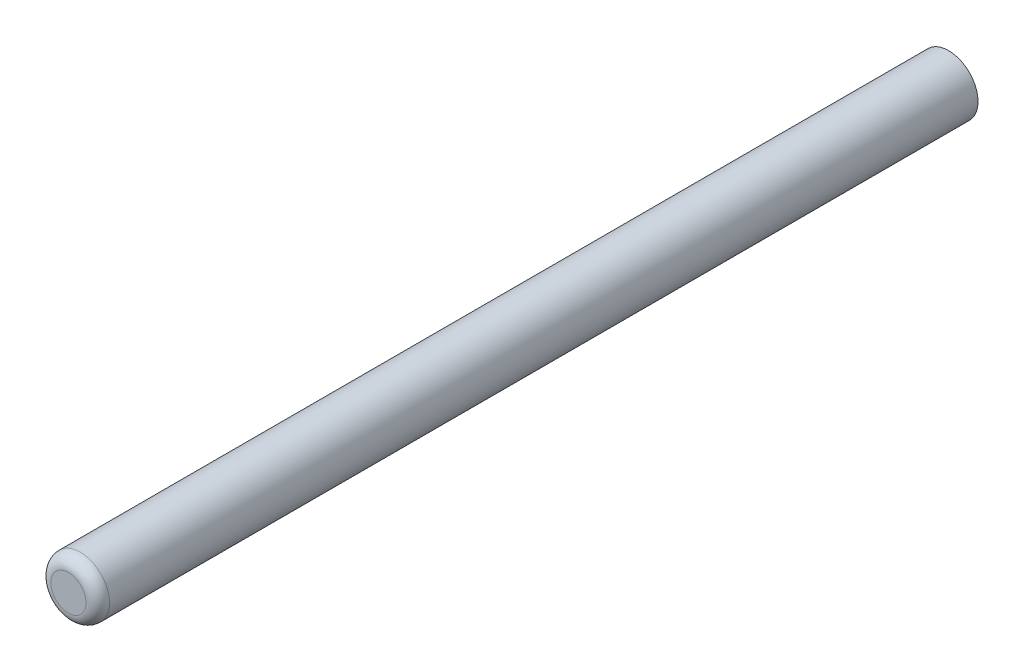
ISO-10303-21;
HEADER;
FILE_DESCRIPTION(('STEP AP214'),'2;1');
FILE_NAME('part.step','',(''),(''),'','','');
FILE_SCHEMA(('AUTOMOTIVE_DESIGN { 1 0 10303 214 1 1 1 1 }'));
ENDSEC;
DATA;
#1=APPLICATION_CONTEXT('core data for automotive mechanical design processes');
#2=APPLICATION_PROTOCOL_DEFINITION('international standard','automotive_design',2000,#1);
#3=PRODUCT_CONTEXT('',#1,'mechanical');
#4=PRODUCT('Part','Part','',(#3));
#5=PRODUCT_RELATED_PRODUCT_CATEGORY('part','',(#4));
#6=PRODUCT_DEFINITION_FORMATION('','',#4);
#7=PRODUCT_DEFINITION_CONTEXT('part definition',#1,'design');
#8=PRODUCT_DEFINITION('design','',#6,#7);
#9=PRODUCT_DEFINITION_SHAPE('','',#8);
#10=(LENGTH_UNIT() NAMED_UNIT(*) SI_UNIT(.MILLI.,.METRE.));
#11=(NAMED_UNIT(*) PLANE_ANGLE_UNIT() SI_UNIT($,.RADIAN.));
#12=(NAMED_UNIT(*) SI_UNIT($,.STERADIAN.) SOLID_ANGLE_UNIT());
#13=UNCERTAINTY_MEASURE_WITH_UNIT(LENGTH_MEASURE(1.E-05),#10,'distance_accuracy_value','');
#14=(GEOMETRIC_REPRESENTATION_CONTEXT(3) GLOBAL_UNCERTAINTY_ASSIGNED_CONTEXT((#13)) GLOBAL_UNIT_ASSIGNED_CONTEXT((#10,
#11,#12)) REPRESENTATION_CONTEXT('',''));
#15=CARTESIAN_POINT('',(0.,0.,0.));
#16=DIRECTION('',(0.,0.,1.));
#17=DIRECTION('',(1.,0.,0.));
#18=AXIS2_PLACEMENT_3D('',#15,#16,#17);
#19=CARTESIAN_POINT('',(3.82033078646985E-09,-9.72969439461123E-07,36.9));
#20=DIRECTION('',(0.,0.,1.));
#21=DIRECTION('',(0.,-1.,0.));
#22=AXIS2_PLACEMENT_3D('',#19,#20,#21);
#23=PLANE('',#22);
#24=CARTESIAN_POINT('',(3.82033071844035E-09,-9.72969439461123E-07,36.9));
#25=DIRECTION('',(0.,0.,-1.));
#26=DIRECTION('',(1.,0.,0.));
#27=AXIS2_PLACEMENT_3D('',#24,#25,#26);
#28=CIRCLE('',#27,0.6);
#29=CARTESIAN_POINT('',(0.600000003820331,-9.72969439387644E-07,36.9));
#30=VERTEX_POINT('',#29);
#31=EDGE_CURVE('E22',#30,#30,#28,.T.);
#32=ORIENTED_EDGE('',*,*,#31,.F.);
#33=EDGE_LOOP('',(#32));
#34=FACE_BOUND('',#33,.T.);
#35=ADVANCED_FACE('F14',(#34),#23,.T.);
#36=CARTESIAN_POINT('',(3.82033071844035E-09,-9.72969439461124E-07,24.9));
#37=DIRECTION('',(0.,0.,1.));
#38=DIRECTION('',(1.,0.,0.));
#39=AXIS2_PLACEMENT_3D('',#36,#37,#38);
#40=CYLINDRICAL_SURFACE('',#39,1.);
#41=CARTESIAN_POINT('',(3.82033960022454E-09,-9.72969544932312E-07,6.9));
#42=DIRECTION('',(0.,0.,-1.));
#43=DIRECTION('',(1.,0.,0.));
#44=AXIS2_PLACEMENT_3D('',#41,#42,#43);
#45=CIRCLE('',#44,1.);
#46=CARTESIAN_POINT('',(1.00000000382034,-9.72969544851481E-07,6.9));
#47=VERTEX_POINT('',#46);
#48=EDGE_CURVE('E31',#47,#47,#45,.T.);
#49=ORIENTED_EDGE('',*,*,#48,.F.);
#50=EDGE_LOOP('',(#49));
#51=FACE_BOUND('',#50,.T.);
#52=CARTESIAN_POINT('',(3.82033071844035E-09,-9.72969439461123E-07,36.5));
#53=DIRECTION('',(0.,0.,1.));
#54=DIRECTION('',(1.,0.,0.));
#55=AXIS2_PLACEMENT_3D('',#52,#53,#54);
#56=CIRCLE('',#55,1.);
#57=CARTESIAN_POINT('',(1.00000000382033,-9.72969439338658E-07,36.5));
#58=VERTEX_POINT('',#57);
#59=EDGE_CURVE('E9',#58,#58,#56,.T.);
#60=ORIENTED_EDGE('',*,*,#59,.F.);
#61=EDGE_LOOP('',(#60));
#62=FACE_BOUND('',#61,.T.);
#63=ADVANCED_FACE('F16',(#51,#62),#40,.T.);
#64=CARTESIAN_POINT('',(3.82033071844035E-09,-9.72969439461123E-07,36.5));
#65=DIRECTION('',(0.,0.,1.));
#66=DIRECTION('',(1.,0.,0.));
#67=AXIS2_PLACEMENT_3D('',#64,#65,#66);
#68=TOROIDAL_SURFACE('',#67,0.6,0.4);
#69=ORIENTED_EDGE('',*,*,#59,.T.);
#70=EDGE_LOOP('',(#69));
#71=FACE_BOUND('',#70,.T.);
#72=ORIENTED_EDGE('',*,*,#31,.T.);
#73=EDGE_LOOP('',(#72));
#74=FACE_BOUND('',#73,.T.);
#75=ADVANCED_FACE('F47',(#71,#74),#68,.T.);
#76=CARTESIAN_POINT('',(3.82033960022454E-09,0.617499027030304,6.8999999999999));
#77=DIRECTION('',(0.,0.,1.));
#78=DIRECTION('',(0.,-1.,0.));
#79=AXIS2_PLACEMENT_3D('',#76,#77,#78);
#80=PLANE('',#79);
#81=ORIENTED_EDGE('',*,*,#48,.T.);
#82=EDGE_LOOP('',(#81));
#83=FACE_BOUND('',#82,.T.);
#84=ADVANCED_FACE('F43',(#83),#80,.F.);
#85=CLOSED_SHELL('',(#35,#63,#75,#84));
#86=MANIFOLD_SOLID_BREP('B1',#85);
#87=ADVANCED_BREP_SHAPE_REPRESENTATION('',(#18,#86),#14);
#88=SHAPE_DEFINITION_REPRESENTATION(#9,#87);
ENDSEC;
END-ISO-10303-21;
